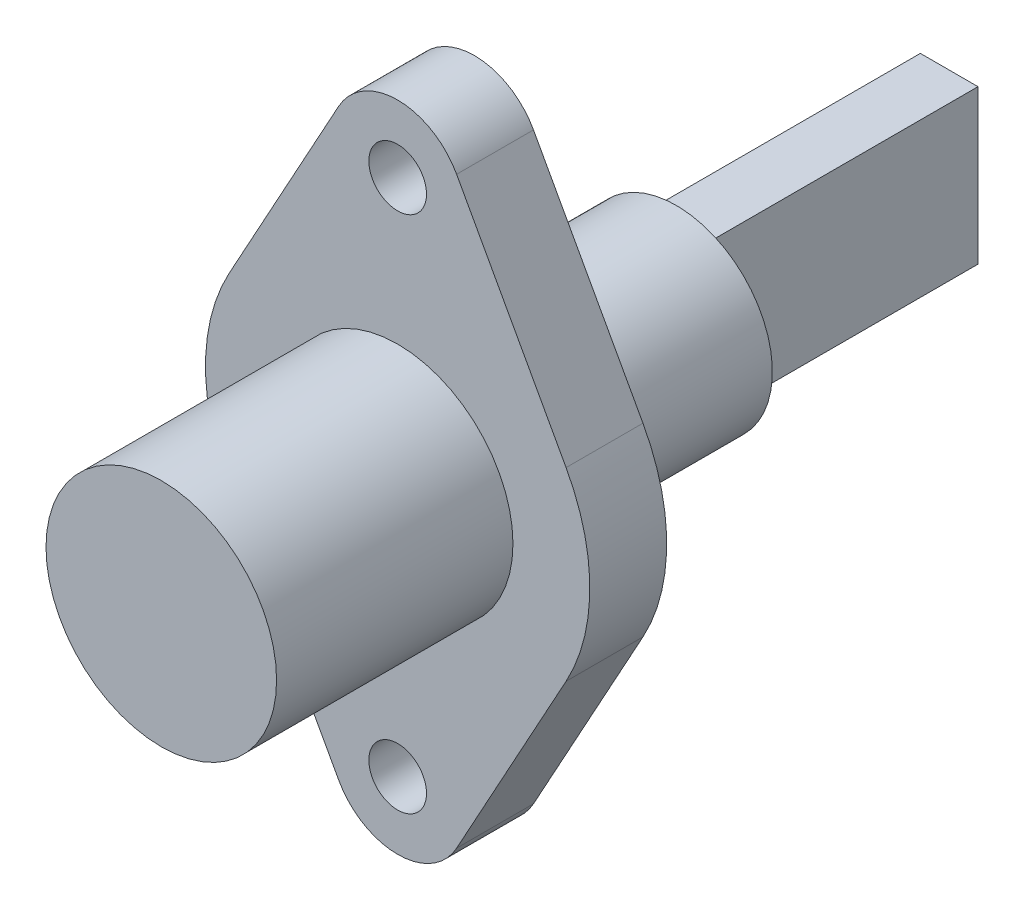
ISO-10303-21;
HEADER;
FILE_DESCRIPTION(('STEP AP214'),'2;1');
FILE_NAME('part.step','',(''),(''),'','','');
FILE_SCHEMA(('AUTOMOTIVE_DESIGN { 1 0 10303 214 1 1 1 1 }'));
ENDSEC;
DATA;
#1=APPLICATION_CONTEXT('core data for automotive mechanical design processes');
#2=APPLICATION_PROTOCOL_DEFINITION('international standard','automotive_design',2000,#1);
#3=PRODUCT_CONTEXT('',#1,'mechanical');
#4=PRODUCT('Part','Part','',(#3));
#5=PRODUCT_RELATED_PRODUCT_CATEGORY('part','',(#4));
#6=PRODUCT_DEFINITION_FORMATION('','',#4);
#7=PRODUCT_DEFINITION_CONTEXT('part definition',#1,'design');
#8=PRODUCT_DEFINITION('design','',#6,#7);
#9=PRODUCT_DEFINITION_SHAPE('','',#8);
#10=(LENGTH_UNIT() NAMED_UNIT(*) SI_UNIT(.MILLI.,.METRE.));
#11=(NAMED_UNIT(*) PLANE_ANGLE_UNIT() SI_UNIT($,.RADIAN.));
#12=(NAMED_UNIT(*) SI_UNIT($,.STERADIAN.) SOLID_ANGLE_UNIT());
#13=UNCERTAINTY_MEASURE_WITH_UNIT(LENGTH_MEASURE(1.E-05),#10,'distance_accuracy_value','');
#14=(GEOMETRIC_REPRESENTATION_CONTEXT(3) GLOBAL_UNCERTAINTY_ASSIGNED_CONTEXT((#13)) GLOBAL_UNIT_ASSIGNED_CONTEXT((#10,
#11,#12)) REPRESENTATION_CONTEXT('',''));
#15=CARTESIAN_POINT('',(0.,0.,0.));
#16=DIRECTION('',(0.,0.,1.));
#17=DIRECTION('',(1.,0.,0.));
#18=AXIS2_PLACEMENT_3D('',#15,#16,#17);
#19=CARTESIAN_POINT('',(0.,-13.5,4.));
#20=DIRECTION('',(0.,0.,-1.));
#21=DIRECTION('',(-1.,0.,0.));
#22=AXIS2_PLACEMENT_3D('',#19,#20,#21);
#23=CYLINDRICAL_SURFACE('',#22,3.5);
#24=CARTESIAN_POINT('',(0.,-13.5,0.));
#25=DIRECTION('',(0.,0.,1.));
#26=DIRECTION('',(1.,0.,0.));
#27=AXIS2_PLACEMENT_3D('',#24,#25,#26);
#28=CIRCLE('',#27,3.5);
#29=CARTESIAN_POINT('',(3.06759692457017,-15.1851851851852,0.));
#30=VERTEX_POINT('',#29);
#31=CARTESIAN_POINT('',(-3.06759692457017,-15.1851851851852,0.));
#32=VERTEX_POINT('',#31);
#33=EDGE_CURVE('E174',#30,#32,#28,.F.);
#34=ORIENTED_EDGE('',*,*,#33,.F.);
#35=DIRECTION('',(0.,0.,-1.));
#36=VECTOR('',#35,1.);
#37=CARTESIAN_POINT('',(3.06759692457017,-15.1851851851852,4.));
#38=LINE('',#37,#36);
#39=CARTESIAN_POINT('',(3.06759692457017,-15.1851851851852,4.));
#40=VERTEX_POINT('',#39);
#41=EDGE_CURVE('E98',#40,#30,#38,.T.);
#42=ORIENTED_EDGE('',*,*,#41,.F.);
#43=CARTESIAN_POINT('',(0.,-13.5,4.));
#44=DIRECTION('',(0.,0.,1.));
#45=DIRECTION('',(1.,0.,0.));
#46=AXIS2_PLACEMENT_3D('',#43,#44,#45);
#47=CIRCLE('',#46,3.5);
#48=CARTESIAN_POINT('',(-3.06759692457017,-15.1851851851852,4.));
#49=VERTEX_POINT('',#48);
#50=EDGE_CURVE('E183',#40,#49,#47,.F.);
#51=ORIENTED_EDGE('',*,*,#50,.T.);
#52=DIRECTION('',(0.,0.,-1.));
#53=VECTOR('',#52,1.);
#54=CARTESIAN_POINT('',(-3.06759692457017,-15.1851851851852,4.));
#55=LINE('',#54,#53);
#56=EDGE_CURVE('E62',#49,#32,#55,.T.);
#57=ORIENTED_EDGE('',*,*,#56,.T.);
#58=EDGE_LOOP('',(#34,#42,#51,#57));
#59=FACE_BOUND('',#58,.T.);
#60=ADVANCED_FACE('F39',(#59),#23,.T.);
#61=CARTESIAN_POINT('',(8.76456264162906,-4.81481481481481,4.));
#62=DIRECTION('',(-0.876456264162906,0.481481481481481,0.));
#63=DIRECTION('',(-0.481481481481481,-0.876456264162906,0.));
#64=AXIS2_PLACEMENT_3D('',#61,#62,#63);
#65=PLANE('',#64);
#66=DIRECTION('',(0.481481481481481,0.876456264162906,0.));
#67=VECTOR('',#66,1.);
#68=CARTESIAN_POINT('',(8.76456264162906,-4.81481481481481,0.));
#69=LINE('',#68,#67);
#70=CARTESIAN_POINT('',(8.76456264162906,-4.81481481481482,0.));
#71=VERTEX_POINT('',#70);
#72=EDGE_CURVE('E198',#30,#71,#69,.T.);
#73=ORIENTED_EDGE('',*,*,#72,.T.);
#74=DIRECTION('',(0.,0.,-1.));
#75=VECTOR('',#74,1.);
#76=CARTESIAN_POINT('',(8.76456264162906,-4.81481481481482,4.));
#77=LINE('',#76,#75);
#78=CARTESIAN_POINT('',(8.76456264162906,-4.81481481481482,4.));
#79=VERTEX_POINT('',#78);
#80=EDGE_CURVE('E154',#79,#71,#77,.T.);
#81=ORIENTED_EDGE('',*,*,#80,.F.);
#82=DIRECTION('',(0.481481481481481,0.876456264162906,0.));
#83=VECTOR('',#82,1.);
#84=CARTESIAN_POINT('',(8.76456264162906,-4.81481481481481,4.));
#85=LINE('',#84,#83);
#86=EDGE_CURVE('E211',#40,#79,#85,.T.);
#87=ORIENTED_EDGE('',*,*,#86,.F.);
#88=ORIENTED_EDGE('',*,*,#41,.T.);
#89=EDGE_LOOP('',(#73,#81,#87,#88));
#90=FACE_BOUND('',#89,.T.);
#91=ADVANCED_FACE('F238',(#90),#65,.F.);
#92=CARTESIAN_POINT('',(0.,0.,4.));
#93=DIRECTION('',(0.,0.,-1.));
#94=DIRECTION('',(-1.,0.,0.));
#95=AXIS2_PLACEMENT_3D('',#92,#93,#94);
#96=CYLINDRICAL_SURFACE('',#95,10.);
#97=CARTESIAN_POINT('',(0.,0.,0.));
#98=DIRECTION('',(0.,0.,1.));
#99=DIRECTION('',(1.,0.,0.));
#100=AXIS2_PLACEMENT_3D('',#97,#98,#99);
#101=CIRCLE('',#100,10.);
#102=CARTESIAN_POINT('',(8.76456264162906,4.81481481481482,0.));
#103=VERTEX_POINT('',#102);
#104=EDGE_CURVE('E201',#71,#103,#101,.T.);
#105=ORIENTED_EDGE('',*,*,#104,.T.);
#106=DIRECTION('',(0.,0.,-1.));
#107=VECTOR('',#106,1.);
#108=CARTESIAN_POINT('',(8.76456264162906,4.81481481481482,4.));
#109=LINE('',#108,#107);
#110=CARTESIAN_POINT('',(8.76456264162906,4.81481481481482,4.));
#111=VERTEX_POINT('',#110);
#112=EDGE_CURVE('E152',#111,#103,#109,.T.);
#113=ORIENTED_EDGE('',*,*,#112,.F.);
#114=CARTESIAN_POINT('',(0.,0.,4.));
#115=DIRECTION('',(0.,0.,1.));
#116=DIRECTION('',(1.,0.,0.));
#117=AXIS2_PLACEMENT_3D('',#114,#115,#116);
#118=CIRCLE('',#117,10.);
#119=EDGE_CURVE('E130',#79,#111,#118,.T.);
#120=ORIENTED_EDGE('',*,*,#119,.F.);
#121=ORIENTED_EDGE('',*,*,#80,.T.);
#122=EDGE_LOOP('',(#105,#113,#120,#121));
#123=FACE_BOUND('',#122,.T.);
#124=ADVANCED_FACE('F225',(#123),#96,.T.);
#125=CARTESIAN_POINT('',(8.76456264162906,4.81481481481482,4.));
#126=DIRECTION('',(0.876456264162906,0.481481481481482,0.));
#127=DIRECTION('',(-0.481481481481482,0.876456264162906,0.));
#128=AXIS2_PLACEMENT_3D('',#125,#126,#127);
#129=PLANE('',#128);
#130=DIRECTION('',(0.481481481481482,-0.876456264162906,0.));
#131=VECTOR('',#130,1.);
#132=CARTESIAN_POINT('',(8.76456264162906,4.81481481481482,0.));
#133=LINE('',#132,#131);
#134=CARTESIAN_POINT('',(3.06759692457017,15.1851851851852,0.));
#135=VERTEX_POINT('',#134);
#136=EDGE_CURVE('E204',#135,#103,#133,.T.);
#137=ORIENTED_EDGE('',*,*,#136,.F.);
#138=DIRECTION('',(0.,0.,-1.));
#139=VECTOR('',#138,1.);
#140=CARTESIAN_POINT('',(3.06759692457017,15.1851851851852,4.));
#141=LINE('',#140,#139);
#142=CARTESIAN_POINT('',(3.06759692457017,15.1851851851852,4.));
#143=VERTEX_POINT('',#142);
#144=EDGE_CURVE('E146',#143,#135,#141,.T.);
#145=ORIENTED_EDGE('',*,*,#144,.F.);
#146=DIRECTION('',(0.481481481481482,-0.876456264162906,0.));
#147=VECTOR('',#146,1.);
#148=CARTESIAN_POINT('',(8.76456264162906,4.81481481481482,4.));
#149=LINE('',#148,#147);
#150=EDGE_CURVE('E217',#143,#111,#149,.T.);
#151=ORIENTED_EDGE('',*,*,#150,.T.);
#152=ORIENTED_EDGE('',*,*,#112,.T.);
#153=EDGE_LOOP('',(#137,#145,#151,#152));
#154=FACE_BOUND('',#153,.T.);
#155=ADVANCED_FACE('F222',(#154),#129,.T.);
#156=CARTESIAN_POINT('',(0.,13.5,4.));
#157=DIRECTION('',(0.,0.,-1.));
#158=DIRECTION('',(-1.,0.,0.));
#159=AXIS2_PLACEMENT_3D('',#156,#157,#158);
#160=CYLINDRICAL_SURFACE('',#159,3.5);
#161=CARTESIAN_POINT('',(0.,13.5,0.));
#162=DIRECTION('',(0.,0.,1.));
#163=DIRECTION('',(1.,0.,0.));
#164=AXIS2_PLACEMENT_3D('',#161,#162,#163);
#165=CIRCLE('',#164,3.5);
#166=CARTESIAN_POINT('',(-3.06759692457017,15.1851851851852,0.));
#167=VERTEX_POINT('',#166);
#168=EDGE_CURVE('E207',#135,#167,#165,.T.);
#169=ORIENTED_EDGE('',*,*,#168,.T.);
#170=DIRECTION('',(0.,0.,-1.));
#171=VECTOR('',#170,1.);
#172=CARTESIAN_POINT('',(-3.06759692457017,15.1851851851852,4.));
#173=LINE('',#172,#171);
#174=CARTESIAN_POINT('',(-3.06759692457017,15.1851851851852,4.));
#175=VERTEX_POINT('',#174);
#176=EDGE_CURVE('E144',#175,#167,#173,.T.);
#177=ORIENTED_EDGE('',*,*,#176,.F.);
#178=CARTESIAN_POINT('',(0.,13.5,4.));
#179=DIRECTION('',(0.,0.,1.));
#180=DIRECTION('',(1.,0.,0.));
#181=AXIS2_PLACEMENT_3D('',#178,#179,#180);
#182=CIRCLE('',#181,3.5);
#183=EDGE_CURVE('E137',#143,#175,#182,.T.);
#184=ORIENTED_EDGE('',*,*,#183,.F.);
#185=ORIENTED_EDGE('',*,*,#144,.T.);
#186=EDGE_LOOP('',(#169,#177,#184,#185));
#187=FACE_BOUND('',#186,.T.);
#188=ADVANCED_FACE('F228',(#187),#160,.T.);
#189=CARTESIAN_POINT('',(-8.76456264162906,4.81481481481482,4.));
#190=DIRECTION('',(0.876456264162906,-0.481481481481482,0.));
#191=DIRECTION('',(0.481481481481482,0.876456264162906,0.));
#192=AXIS2_PLACEMENT_3D('',#189,#190,#191);
#193=PLANE('',#192);
#194=DIRECTION('',(-0.481481481481482,-0.876456264162906,0.));
#195=VECTOR('',#194,1.);
#196=CARTESIAN_POINT('',(-8.76456264162906,4.81481481481482,0.));
#197=LINE('',#196,#195);
#198=CARTESIAN_POINT('',(-8.76456264162906,4.81481481481482,0.));
#199=VERTEX_POINT('',#198);
#200=EDGE_CURVE('E143',#167,#199,#197,.T.);
#201=ORIENTED_EDGE('',*,*,#200,.T.);
#202=DIRECTION('',(0.,0.,-1.));
#203=VECTOR('',#202,1.);
#204=CARTESIAN_POINT('',(-8.76456264162906,4.81481481481482,4.));
#205=LINE('',#204,#203);
#206=CARTESIAN_POINT('',(-8.76456264162906,4.81481481481482,4.));
#207=VERTEX_POINT('',#206);
#208=EDGE_CURVE('E122',#207,#199,#205,.T.);
#209=ORIENTED_EDGE('',*,*,#208,.F.);
#210=DIRECTION('',(-0.481481481481482,-0.876456264162906,0.));
#211=VECTOR('',#210,1.);
#212=CARTESIAN_POINT('',(-8.76456264162906,4.81481481481482,4.));
#213=LINE('',#212,#211);
#214=EDGE_CURVE('E128',#175,#207,#213,.T.);
#215=ORIENTED_EDGE('',*,*,#214,.F.);
#216=ORIENTED_EDGE('',*,*,#176,.T.);
#217=EDGE_LOOP('',(#201,#209,#215,#216));
#218=FACE_BOUND('',#217,.T.);
#219=ADVANCED_FACE('F142',(#218),#193,.F.);
#220=CARTESIAN_POINT('',(-8.76456264162906,-4.81481481481482,0.));
#221=VERTEX_POINT('',#220);
#222=EDGE_CURVE('E185',#199,#221,#101,.T.);
#223=ORIENTED_EDGE('',*,*,#222,.T.);
#224=DIRECTION('',(0.,0.,-1.));
#225=VECTOR('',#224,1.);
#226=CARTESIAN_POINT('',(-8.76456264162906,-4.81481481481482,4.));
#227=LINE('',#226,#225);
#228=CARTESIAN_POINT('',(-8.76456264162906,-4.81481481481482,4.));
#229=VERTEX_POINT('',#228);
#230=EDGE_CURVE('E124',#229,#221,#227,.T.);
#231=ORIENTED_EDGE('',*,*,#230,.F.);
#232=EDGE_CURVE('E117',#207,#229,#118,.T.);
#233=ORIENTED_EDGE('',*,*,#232,.F.);
#234=ORIENTED_EDGE('',*,*,#208,.T.);
#235=EDGE_LOOP('',(#223,#231,#233,#234));
#236=FACE_BOUND('',#235,.T.);
#237=ADVANCED_FACE('F120',(#236),#96,.T.);
#238=CARTESIAN_POINT('',(-8.76456264162906,-4.81481481481482,4.));
#239=DIRECTION('',(-0.876456264162906,-0.481481481481482,0.));
#240=DIRECTION('',(0.481481481481482,-0.876456264162906,0.));
#241=AXIS2_PLACEMENT_3D('',#238,#239,#240);
#242=PLANE('',#241);
#243=DIRECTION('',(-0.481481481481482,0.876456264162906,0.));
#244=VECTOR('',#243,1.);
#245=CARTESIAN_POINT('',(-8.76456264162906,-4.81481481481482,0.));
#246=LINE('',#245,#244);
#247=EDGE_CURVE('E180',#32,#221,#246,.T.);
#248=ORIENTED_EDGE('',*,*,#247,.F.);
#249=ORIENTED_EDGE('',*,*,#56,.F.);
#250=DIRECTION('',(-0.481481481481482,0.876456264162906,0.));
#251=VECTOR('',#250,1.);
#252=CARTESIAN_POINT('',(-8.76456264162906,-4.81481481481482,4.));
#253=LINE('',#252,#251);
#254=EDGE_CURVE('E127',#49,#229,#253,.T.);
#255=ORIENTED_EDGE('',*,*,#254,.T.);
#256=ORIENTED_EDGE('',*,*,#230,.T.);
#257=EDGE_LOOP('',(#248,#249,#255,#256));
#258=FACE_BOUND('',#257,.T.);
#259=ADVANCED_FACE('F209',(#258),#242,.T.);
#260=CARTESIAN_POINT('',(0.,-13.5,4.));
#261=DIRECTION('',(0.,0.,-1.));
#262=DIRECTION('',(-1.,0.,0.));
#263=AXIS2_PLACEMENT_3D('',#260,#261,#262);
#264=CYLINDRICAL_SURFACE('',#263,1.5);
#265=CARTESIAN_POINT('',(0.,-13.5,4.));
#266=DIRECTION('',(0.,0.,1.));
#267=DIRECTION('',(1.,0.,0.));
#268=AXIS2_PLACEMENT_3D('',#265,#266,#267);
#269=CIRCLE('',#268,1.5);
#270=CARTESIAN_POINT('',(1.5,-13.5,4.));
#271=VERTEX_POINT('',#270);
#272=EDGE_CURVE('E179',#271,#271,#269,.T.);
#273=ORIENTED_EDGE('',*,*,#272,.T.);
#274=EDGE_LOOP('',(#273));
#275=FACE_BOUND('',#274,.T.);
#276=CARTESIAN_POINT('',(0.,-13.5,0.));
#277=DIRECTION('',(0.,0.,1.));
#278=DIRECTION('',(1.,0.,0.));
#279=AXIS2_PLACEMENT_3D('',#276,#277,#278);
#280=CIRCLE('',#279,1.5);
#281=CARTESIAN_POINT('',(1.5,-13.5,0.));
#282=VERTEX_POINT('',#281);
#283=EDGE_CURVE('E170',#282,#282,#280,.T.);
#284=ORIENTED_EDGE('',*,*,#283,.F.);
#285=EDGE_LOOP('',(#284));
#286=FACE_BOUND('',#285,.T.);
#287=ADVANCED_FACE('F41',(#275,#286),#264,.F.);
#288=CARTESIAN_POINT('',(0.,13.5,4.));
#289=DIRECTION('',(0.,0.,-1.));
#290=DIRECTION('',(-1.,0.,0.));
#291=AXIS2_PLACEMENT_3D('',#288,#289,#290);
#292=CYLINDRICAL_SURFACE('',#291,1.5);
#293=CARTESIAN_POINT('',(0.,13.5,4.));
#294=DIRECTION('',(0.,0.,1.));
#295=DIRECTION('',(1.,0.,0.));
#296=AXIS2_PLACEMENT_3D('',#293,#294,#295);
#297=CIRCLE('',#296,1.5);
#298=CARTESIAN_POINT('',(1.5,13.5,4.));
#299=VERTEX_POINT('',#298);
#300=EDGE_CURVE('E188',#299,#299,#297,.T.);
#301=ORIENTED_EDGE('',*,*,#300,.T.);
#302=EDGE_LOOP('',(#301));
#303=FACE_BOUND('',#302,.T.);
#304=CARTESIAN_POINT('',(0.,13.5,0.));
#305=DIRECTION('',(0.,0.,1.));
#306=DIRECTION('',(1.,0.,0.));
#307=AXIS2_PLACEMENT_3D('',#304,#305,#306);
#308=CIRCLE('',#307,1.5);
#309=CARTESIAN_POINT('',(1.5,13.5,0.));
#310=VERTEX_POINT('',#309);
#311=EDGE_CURVE('E177',#310,#310,#308,.T.);
#312=ORIENTED_EDGE('',*,*,#311,.F.);
#313=EDGE_LOOP('',(#312));
#314=FACE_BOUND('',#313,.T.);
#315=ADVANCED_FACE('F258',(#303,#314),#292,.F.);
#316=CARTESIAN_POINT('',(0.,0.,4.));
#317=DIRECTION('',(0.,0.,1.));
#318=DIRECTION('',(1.,0.,0.));
#319=AXIS2_PLACEMENT_3D('',#316,#317,#318);
#320=PLANE('',#319);
#321=CARTESIAN_POINT('',(0.,0.,4.));
#322=DIRECTION('',(0.,0.,1.));
#323=DIRECTION('',(1.,0.,0.));
#324=AXIS2_PLACEMENT_3D('',#321,#322,#323);
#325=CIRCLE('',#324,6.);
#326=CARTESIAN_POINT('',(6.,0.,4.));
#327=VERTEX_POINT('',#326);
#328=EDGE_CURVE('E351',#327,#327,#325,.T.);
#329=ORIENTED_EDGE('',*,*,#328,.F.);
#330=EDGE_LOOP('',(#329));
#331=FACE_BOUND('',#330,.T.);
#332=ORIENTED_EDGE('',*,*,#272,.F.);
#333=EDGE_LOOP('',(#332));
#334=FACE_BOUND('',#333,.T.);
#335=ORIENTED_EDGE('',*,*,#50,.F.);
#336=ORIENTED_EDGE('',*,*,#86,.T.);
#337=ORIENTED_EDGE('',*,*,#119,.T.);
#338=ORIENTED_EDGE('',*,*,#150,.F.);
#339=ORIENTED_EDGE('',*,*,#183,.T.);
#340=ORIENTED_EDGE('',*,*,#214,.T.);
#341=ORIENTED_EDGE('',*,*,#232,.T.);
#342=ORIENTED_EDGE('',*,*,#254,.F.);
#343=EDGE_LOOP('',(#335,#336,#337,#338,#339,#340,#341,#342));
#344=FACE_BOUND('',#343,.T.);
#345=ORIENTED_EDGE('',*,*,#300,.F.);
#346=EDGE_LOOP('',(#345));
#347=FACE_BOUND('',#346,.T.);
#348=ADVANCED_FACE('F133',(#331,#334,#344,#347),#320,.T.);
#349=CARTESIAN_POINT('',(0.,0.,0.));
#350=DIRECTION('',(0.,0.,1.));
#351=DIRECTION('',(1.,0.,0.));
#352=AXIS2_PLACEMENT_3D('',#349,#350,#351);
#353=PLANE('',#352);
#354=CARTESIAN_POINT('',(0.,0.,0.));
#355=DIRECTION('',(0.,0.,1.));
#356=DIRECTION('',(1.,0.,0.));
#357=AXIS2_PLACEMENT_3D('',#354,#355,#356);
#358=CIRCLE('',#357,7.5);
#359=CARTESIAN_POINT('',(7.5,0.,0.));
#360=VERTEX_POINT('',#359);
#361=EDGE_CURVE('E47',#360,#360,#358,.F.);
#362=ORIENTED_EDGE('',*,*,#361,.F.);
#363=EDGE_LOOP('',(#362));
#364=FACE_BOUND('',#363,.T.);
#365=ORIENTED_EDGE('',*,*,#283,.T.);
#366=EDGE_LOOP('',(#365));
#367=FACE_BOUND('',#366,.T.);
#368=ORIENTED_EDGE('',*,*,#33,.T.);
#369=ORIENTED_EDGE('',*,*,#247,.T.);
#370=ORIENTED_EDGE('',*,*,#222,.F.);
#371=ORIENTED_EDGE('',*,*,#200,.F.);
#372=ORIENTED_EDGE('',*,*,#168,.F.);
#373=ORIENTED_EDGE('',*,*,#136,.T.);
#374=ORIENTED_EDGE('',*,*,#104,.F.);
#375=ORIENTED_EDGE('',*,*,#72,.F.);
#376=EDGE_LOOP('',(#368,#369,#370,#371,#372,#373,#374,#375));
#377=FACE_BOUND('',#376,.T.);
#378=ORIENTED_EDGE('',*,*,#311,.T.);
#379=EDGE_LOOP('',(#378));
#380=FACE_BOUND('',#379,.T.);
#381=ADVANCED_FACE('F162',(#364,#367,#377,#380),#353,.F.);
#382=CARTESIAN_POINT('',(0.,0.,16.3));
#383=DIRECTION('',(0.,0.,-1.));
#384=DIRECTION('',(-1.,0.,0.));
#385=AXIS2_PLACEMENT_3D('',#382,#383,#384);
#386=CYLINDRICAL_SURFACE('',#385,6.);
#387=CARTESIAN_POINT('',(0.,0.,16.3));
#388=DIRECTION('',(0.,0.,1.));
#389=DIRECTION('',(1.,0.,0.));
#390=AXIS2_PLACEMENT_3D('',#387,#388,#389);
#391=CIRCLE('',#390,6.);
#392=CARTESIAN_POINT('',(6.,0.,16.3));
#393=VERTEX_POINT('',#392);
#394=EDGE_CURVE('E196',#393,#393,#391,.T.);
#395=ORIENTED_EDGE('',*,*,#394,.F.);
#396=EDGE_LOOP('',(#395));
#397=FACE_BOUND('',#396,.T.);
#398=ORIENTED_EDGE('',*,*,#328,.T.);
#399=EDGE_LOOP('',(#398));
#400=FACE_BOUND('',#399,.T.);
#401=ADVANCED_FACE('F165',(#397,#400),#386,.T.);
#402=CARTESIAN_POINT('',(0.,0.,16.3));
#403=DIRECTION('',(0.,0.,1.));
#404=DIRECTION('',(1.,0.,0.));
#405=AXIS2_PLACEMENT_3D('',#402,#403,#404);
#406=PLANE('',#405);
#407=ORIENTED_EDGE('',*,*,#394,.T.);
#408=EDGE_LOOP('',(#407));
#409=FACE_BOUND('',#408,.T.);
#410=ADVANCED_FACE('F268',(#409),#406,.T.);
#411=CARTESIAN_POINT('',(0.,0.,-0.5));
#412=DIRECTION('',(0.,0.,1.));
#413=DIRECTION('',(1.,0.,0.));
#414=AXIS2_PLACEMENT_3D('',#411,#412,#413);
#415=CYLINDRICAL_SURFACE('',#414,7.5);
#416=CARTESIAN_POINT('',(0.,0.,-0.5));
#417=DIRECTION('',(0.,0.,-1.));
#418=DIRECTION('',(-1.,0.,0.));
#419=AXIS2_PLACEMENT_3D('',#416,#417,#418);
#420=CIRCLE('',#419,7.5);
#421=CARTESIAN_POINT('',(-7.5,0.,-0.5));
#422=VERTEX_POINT('',#421);
#423=EDGE_CURVE('E348',#422,#422,#420,.T.);
#424=ORIENTED_EDGE('',*,*,#423,.F.);
#425=EDGE_LOOP('',(#424));
#426=FACE_BOUND('',#425,.T.);
#427=ORIENTED_EDGE('',*,*,#361,.T.);
#428=EDGE_LOOP('',(#427));
#429=FACE_BOUND('',#428,.T.);
#430=ADVANCED_FACE('F160',(#426,#429),#415,.T.);
#431=CARTESIAN_POINT('',(0.,0.,-0.5));
#432=DIRECTION('',(0.,0.,-1.));
#433=DIRECTION('',(-1.,0.,0.));
#434=AXIS2_PLACEMENT_3D('',#431,#432,#433);
#435=PLANE('',#434);
#436=CARTESIAN_POINT('',(0.,0.,-0.5));
#437=DIRECTION('',(0.,0.,-1.));
#438=DIRECTION('',(-1.,0.,0.));
#439=AXIS2_PLACEMENT_3D('',#436,#437,#438);
#440=CIRCLE('',#439,5.);
#441=CARTESIAN_POINT('',(-5.,0.,-0.5));
#442=VERTEX_POINT('',#441);
#443=EDGE_CURVE('E313',#442,#442,#440,.T.);
#444=ORIENTED_EDGE('',*,*,#443,.F.);
#445=EDGE_LOOP('',(#444));
#446=FACE_BOUND('',#445,.T.);
#447=ORIENTED_EDGE('',*,*,#423,.T.);
#448=EDGE_LOOP('',(#447));
#449=FACE_BOUND('',#448,.T.);
#450=ADVANCED_FACE('F275',(#446,#449),#435,.T.);
#451=CARTESIAN_POINT('',(0.,0.,-10.5));
#452=DIRECTION('',(0.,0.,-1.));
#453=DIRECTION('',(-1.,0.,0.));
#454=AXIS2_PLACEMENT_3D('',#451,#452,#453);
#455=PLANE('',#454);
#456=CARTESIAN_POINT('',(0.,0.,-10.5));
#457=DIRECTION('',(0.,0.,-1.));
#458=DIRECTION('',(-1.,0.,0.));
#459=AXIS2_PLACEMENT_3D('',#456,#457,#458);
#460=CIRCLE('',#459,5.);
#461=CARTESIAN_POINT('',(-5.,0.,-10.5));
#462=VERTEX_POINT('',#461);
#463=EDGE_CURVE('E311',#462,#462,#460,.T.);
#464=ORIENTED_EDGE('',*,*,#463,.T.);
#465=EDGE_LOOP('',(#464));
#466=FACE_BOUND('',#465,.T.);
#467=DIRECTION('',(0.,1.,0.));
#468=VECTOR('',#467,1.);
#469=CARTESIAN_POINT('',(-1.5,4.,-10.5));
#470=LINE('',#469,#468);
#471=CARTESIAN_POINT('',(-1.5,-4.,-10.5));
#472=VERTEX_POINT('',#471);
#473=CARTESIAN_POINT('',(-1.5,4.,-10.5));
#474=VERTEX_POINT('',#473);
#475=EDGE_CURVE('E54',#472,#474,#470,.T.);
#476=ORIENTED_EDGE('',*,*,#475,.F.);
#477=DIRECTION('',(-1.,0.,0.));
#478=VECTOR('',#477,1.);
#479=CARTESIAN_POINT('',(1.5,-4.,-10.5));
#480=LINE('',#479,#478);
#481=CARTESIAN_POINT('',(1.5,-4.,-10.5));
#482=VERTEX_POINT('',#481);
#483=EDGE_CURVE('E11',#482,#472,#480,.T.);
#484=ORIENTED_EDGE('',*,*,#483,.F.);
#485=DIRECTION('',(0.,-1.,0.));
#486=VECTOR('',#485,1.);
#487=CARTESIAN_POINT('',(1.5,4.,-10.5));
#488=LINE('',#487,#486);
#489=CARTESIAN_POINT('',(1.5,4.,-10.5));
#490=VERTEX_POINT('',#489);
#491=EDGE_CURVE('E312',#490,#482,#488,.T.);
#492=ORIENTED_EDGE('',*,*,#491,.F.);
#493=DIRECTION('',(1.,0.,0.));
#494=VECTOR('',#493,1.);
#495=CARTESIAN_POINT('',(1.5,4.,-10.5));
#496=LINE('',#495,#494);
#497=EDGE_CURVE('E316',#474,#490,#496,.T.);
#498=ORIENTED_EDGE('',*,*,#497,.F.);
#499=EDGE_LOOP('',(#476,#484,#492,#498));
#500=FACE_BOUND('',#499,.T.);
#501=ADVANCED_FACE('F279',(#466,#500),#455,.T.);
#502=CARTESIAN_POINT('',(0.,0.,-10.5));
#503=DIRECTION('',(0.,0.,1.));
#504=DIRECTION('',(1.,0.,0.));
#505=AXIS2_PLACEMENT_3D('',#502,#503,#504);
#506=CYLINDRICAL_SURFACE('',#505,5.);
#507=ORIENTED_EDGE('',*,*,#463,.F.);
#508=EDGE_LOOP('',(#507));
#509=FACE_BOUND('',#508,.T.);
#510=ORIENTED_EDGE('',*,*,#443,.T.);
#511=EDGE_LOOP('',(#510));
#512=FACE_BOUND('',#511,.T.);
#513=ADVANCED_FACE('F300',(#509,#512),#506,.T.);
#514=CARTESIAN_POINT('',(0.,0.,-24.7));
#515=DIRECTION('',(0.,0.,-1.));
#516=DIRECTION('',(-1.,0.,0.));
#517=AXIS2_PLACEMENT_3D('',#514,#515,#516);
#518=PLANE('',#517);
#519=DIRECTION('',(0.,1.,0.));
#520=VECTOR('',#519,1.);
#521=CARTESIAN_POINT('',(-1.5,4.,-24.7));
#522=LINE('',#521,#520);
#523=CARTESIAN_POINT('',(-1.5,-4.,-24.7));
#524=VERTEX_POINT('',#523);
#525=CARTESIAN_POINT('',(-1.5,4.,-24.7));
#526=VERTEX_POINT('',#525);
#527=EDGE_CURVE('E324',#524,#526,#522,.T.);
#528=ORIENTED_EDGE('',*,*,#527,.T.);
#529=DIRECTION('',(1.,0.,0.));
#530=VECTOR('',#529,1.);
#531=CARTESIAN_POINT('',(1.5,4.,-24.7));
#532=LINE('',#531,#530);
#533=CARTESIAN_POINT('',(1.5,4.,-24.7));
#534=VERTEX_POINT('',#533);
#535=EDGE_CURVE('E327',#526,#534,#532,.T.);
#536=ORIENTED_EDGE('',*,*,#535,.T.);
#537=DIRECTION('',(0.,-1.,0.));
#538=VECTOR('',#537,1.);
#539=CARTESIAN_POINT('',(1.5,4.,-24.7));
#540=LINE('',#539,#538);
#541=CARTESIAN_POINT('',(1.5,-4.,-24.7));
#542=VERTEX_POINT('',#541);
#543=EDGE_CURVE('E330',#534,#542,#540,.T.);
#544=ORIENTED_EDGE('',*,*,#543,.T.);
#545=DIRECTION('',(-1.,0.,0.));
#546=VECTOR('',#545,1.);
#547=CARTESIAN_POINT('',(1.5,-4.,-24.7));
#548=LINE('',#547,#546);
#549=EDGE_CURVE('E333',#542,#524,#548,.T.);
#550=ORIENTED_EDGE('',*,*,#549,.T.);
#551=EDGE_LOOP('',(#528,#536,#544,#550));
#552=FACE_BOUND('',#551,.T.);
#553=ADVANCED_FACE('F296',(#552),#518,.T.);
#554=CARTESIAN_POINT('',(1.5,-4.,-24.7));
#555=DIRECTION('',(0.,1.,0.));
#556=DIRECTION('',(0.,0.,1.));
#557=AXIS2_PLACEMENT_3D('',#554,#555,#556);
#558=PLANE('',#557);
#559=DIRECTION('',(0.,0.,1.));
#560=VECTOR('',#559,1.);
#561=CARTESIAN_POINT('',(1.5,-4.,-24.7));
#562=LINE('',#561,#560);
#563=EDGE_CURVE('E339',#542,#482,#562,.T.);
#564=ORIENTED_EDGE('',*,*,#563,.T.);
#565=ORIENTED_EDGE('',*,*,#483,.T.);
#566=DIRECTION('',(0.,0.,1.));
#567=VECTOR('',#566,1.);
#568=CARTESIAN_POINT('',(-1.5,-4.,-24.7));
#569=LINE('',#568,#567);
#570=EDGE_CURVE('E336',#524,#472,#569,.T.);
#571=ORIENTED_EDGE('',*,*,#570,.F.);
#572=ORIENTED_EDGE('',*,*,#549,.F.);
#573=EDGE_LOOP('',(#564,#565,#571,#572));
#574=FACE_BOUND('',#573,.T.);
#575=ADVANCED_FACE('F292',(#574),#558,.F.);
#576=CARTESIAN_POINT('',(1.5,4.,-24.7));
#577=DIRECTION('',(-1.,0.,0.));
#578=DIRECTION('',(0.,-1.,0.));
#579=AXIS2_PLACEMENT_3D('',#576,#577,#578);
#580=PLANE('',#579);
#581=DIRECTION('',(0.,0.,1.));
#582=VECTOR('',#581,1.);
#583=CARTESIAN_POINT('',(1.5,4.,-24.7));
#584=LINE('',#583,#582);
#585=EDGE_CURVE('E342',#534,#490,#584,.T.);
#586=ORIENTED_EDGE('',*,*,#585,.T.);
#587=ORIENTED_EDGE('',*,*,#491,.T.);
#588=ORIENTED_EDGE('',*,*,#563,.F.);
#589=ORIENTED_EDGE('',*,*,#543,.F.);
#590=EDGE_LOOP('',(#586,#587,#588,#589));
#591=FACE_BOUND('',#590,.T.);
#592=ADVANCED_FACE('F288',(#591),#580,.F.);
#593=CARTESIAN_POINT('',(1.5,4.,-24.7));
#594=DIRECTION('',(0.,-1.,0.));
#595=DIRECTION('',(0.,0.,-1.));
#596=AXIS2_PLACEMENT_3D('',#593,#594,#595);
#597=PLANE('',#596);
#598=DIRECTION('',(0.,0.,1.));
#599=VECTOR('',#598,1.);
#600=CARTESIAN_POINT('',(-1.5,4.,-24.7));
#601=LINE('',#600,#599);
#602=EDGE_CURVE('E345',#526,#474,#601,.T.);
#603=ORIENTED_EDGE('',*,*,#602,.T.);
#604=ORIENTED_EDGE('',*,*,#497,.T.);
#605=ORIENTED_EDGE('',*,*,#585,.F.);
#606=ORIENTED_EDGE('',*,*,#535,.F.);
#607=EDGE_LOOP('',(#603,#604,#605,#606));
#608=FACE_BOUND('',#607,.T.);
#609=ADVANCED_FACE('F284',(#608),#597,.F.);
#610=CARTESIAN_POINT('',(-1.5,4.,-24.7));
#611=DIRECTION('',(1.,0.,0.));
#612=DIRECTION('',(0.,1.,0.));
#613=AXIS2_PLACEMENT_3D('',#610,#611,#612);
#614=PLANE('',#613);
#615=ORIENTED_EDGE('',*,*,#570,.T.);
#616=ORIENTED_EDGE('',*,*,#475,.T.);
#617=ORIENTED_EDGE('',*,*,#602,.F.);
#618=ORIENTED_EDGE('',*,*,#527,.F.);
#619=EDGE_LOOP('',(#615,#616,#617,#618));
#620=FACE_BOUND('',#619,.T.);
#621=ADVANCED_FACE('F281',(#620),#614,.F.);
#622=CLOSED_SHELL('',(#60,#91,#124,#155,#188,#219,#237,#259,#287,#315,#348,#381,#401,#410,#430,
#450,#501,#513,#553,#575,#592,#609,#621));
#623=MANIFOLD_SOLID_BREP('B2',#622);
#624=ADVANCED_BREP_SHAPE_REPRESENTATION('',(#18,#623),#14);
#625=SHAPE_DEFINITION_REPRESENTATION(#9,#624);
ENDSEC;
END-ISO-10303-21;
